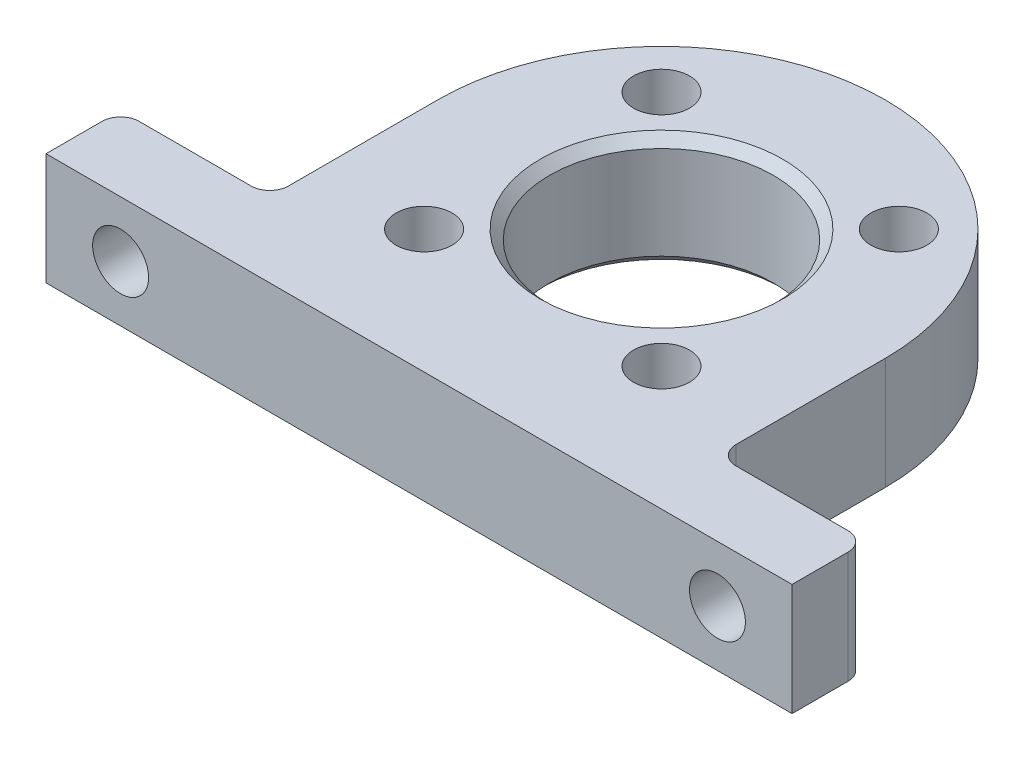
ISO-10303-21;
HEADER;
FILE_DESCRIPTION(('STEP AP214'),'2;1');
FILE_NAME('part.step','',(''),(''),'','','');
FILE_SCHEMA(('AUTOMOTIVE_DESIGN { 1 0 10303 214 1 1 1 1 }'));
ENDSEC;
DATA;
#1=APPLICATION_CONTEXT('core data for automotive mechanical design processes');
#2=APPLICATION_PROTOCOL_DEFINITION('international standard','automotive_design',2000,#1);
#3=PRODUCT_CONTEXT('',#1,'mechanical');
#4=PRODUCT('Part','Part','',(#3));
#5=PRODUCT_RELATED_PRODUCT_CATEGORY('part','',(#4));
#6=PRODUCT_DEFINITION_FORMATION('','',#4);
#7=PRODUCT_DEFINITION_CONTEXT('part definition',#1,'design');
#8=PRODUCT_DEFINITION('design','',#6,#7);
#9=PRODUCT_DEFINITION_SHAPE('','',#8);
#10=(LENGTH_UNIT() NAMED_UNIT(*) SI_UNIT(.MILLI.,.METRE.));
#11=(NAMED_UNIT(*) PLANE_ANGLE_UNIT() SI_UNIT($,.RADIAN.));
#12=(NAMED_UNIT(*) SI_UNIT($,.STERADIAN.) SOLID_ANGLE_UNIT());
#13=UNCERTAINTY_MEASURE_WITH_UNIT(LENGTH_MEASURE(1.E-05),#10,'distance_accuracy_value','');
#14=(GEOMETRIC_REPRESENTATION_CONTEXT(3) GLOBAL_UNCERTAINTY_ASSIGNED_CONTEXT((#13)) GLOBAL_UNIT_ASSIGNED_CONTEXT((#10,
#11,#12)) REPRESENTATION_CONTEXT('',''));
#15=CARTESIAN_POINT('',(0.,0.,0.));
#16=DIRECTION('',(0.,0.,1.));
#17=DIRECTION('',(1.,0.,0.));
#18=AXIS2_PLACEMENT_3D('',#15,#16,#17);
#19=CARTESIAN_POINT('',(-12.,6.,0.));
#20=DIRECTION('',(1.,0.,0.));
#21=DIRECTION('',(0.,0.,-1.));
#22=AXIS2_PLACEMENT_3D('',#19,#20,#21);
#23=PLANE('',#22);
#24=DIRECTION('',(0.,0.,1.));
#25=VECTOR('',#24,1.);
#26=CARTESIAN_POINT('',(-12.,0.,0.));
#27=LINE('',#26,#25);
#28=CARTESIAN_POINT('',(-12.,0.,0.));
#29=VERTEX_POINT('',#28);
#30=CARTESIAN_POINT('',(-12.,0.,8.));
#31=VERTEX_POINT('',#30);
#32=EDGE_CURVE('E154',#29,#31,#27,.T.);
#33=ORIENTED_EDGE('',*,*,#32,.T.);
#34=DIRECTION('',(0.,-1.,0.));
#35=VECTOR('',#34,1.);
#36=CARTESIAN_POINT('',(-12.,6.,8.));
#37=LINE('',#36,#35);
#38=CARTESIAN_POINT('',(-12.,6.,8.));
#39=VERTEX_POINT('',#38);
#40=EDGE_CURVE('E245',#31,#39,#37,.F.);
#41=ORIENTED_EDGE('',*,*,#40,.T.);
#42=DIRECTION('',(0.,0.,1.));
#43=VECTOR('',#42,1.);
#44=CARTESIAN_POINT('',(-12.,6.,0.));
#45=LINE('',#44,#43);
#46=CARTESIAN_POINT('',(-12.,6.,0.));
#47=VERTEX_POINT('',#46);
#48=EDGE_CURVE('E205',#47,#39,#45,.T.);
#49=ORIENTED_EDGE('',*,*,#48,.F.);
#50=DIRECTION('',(0.,-1.,0.));
#51=VECTOR('',#50,1.);
#52=CARTESIAN_POINT('',(-12.,6.,0.));
#53=LINE('',#52,#51);
#54=EDGE_CURVE('E218',#47,#29,#53,.T.);
#55=ORIENTED_EDGE('',*,*,#54,.T.);
#56=EDGE_LOOP('',(#33,#41,#49,#55));
#57=FACE_BOUND('',#56,.T.);
#58=ADVANCED_FACE('F41',(#57),#23,.F.);
#59=CARTESIAN_POINT('',(12.,6.,0.));
#60=DIRECTION('',(-1.,0.,0.));
#61=DIRECTION('',(0.,0.,1.));
#62=AXIS2_PLACEMENT_3D('',#59,#60,#61);
#63=PLANE('',#62);
#64=DIRECTION('',(0.,0.,-1.));
#65=VECTOR('',#64,1.);
#66=CARTESIAN_POINT('',(12.,6.,0.));
#67=LINE('',#66,#65);
#68=CARTESIAN_POINT('',(12.,6.,8.));
#69=VERTEX_POINT('',#68);
#70=CARTESIAN_POINT('',(12.,6.,0.));
#71=VERTEX_POINT('',#70);
#72=EDGE_CURVE('E209',#69,#71,#67,.T.);
#73=ORIENTED_EDGE('',*,*,#72,.F.);
#74=DIRECTION('',(0.,1.,0.));
#75=VECTOR('',#74,1.);
#76=CARTESIAN_POINT('',(12.,0.,8.));
#77=LINE('',#76,#75);
#78=CARTESIAN_POINT('',(12.,0.,8.));
#79=VERTEX_POINT('',#78);
#80=EDGE_CURVE('E57',#69,#79,#77,.F.);
#81=ORIENTED_EDGE('',*,*,#80,.T.);
#82=DIRECTION('',(0.,0.,-1.));
#83=VECTOR('',#82,1.);
#84=CARTESIAN_POINT('',(12.,0.,0.));
#85=LINE('',#84,#83);
#86=CARTESIAN_POINT('',(12.,0.,0.));
#87=VERTEX_POINT('',#86);
#88=EDGE_CURVE('E153',#79,#87,#85,.T.);
#89=ORIENTED_EDGE('',*,*,#88,.T.);
#90=DIRECTION('',(0.,-1.,0.));
#91=VECTOR('',#90,1.);
#92=CARTESIAN_POINT('',(12.,6.,0.));
#93=LINE('',#92,#91);
#94=EDGE_CURVE('E211',#71,#87,#93,.T.);
#95=ORIENTED_EDGE('',*,*,#94,.F.);
#96=EDGE_LOOP('',(#73,#81,#89,#95));
#97=FACE_BOUND('',#96,.T.);
#98=ADVANCED_FACE('F292',(#97),#63,.F.);
#99=CARTESIAN_POINT('',(0.,6.,0.));
#100=DIRECTION('',(0.,-1.,0.));
#101=DIRECTION('',(0.,0.,-1.));
#102=AXIS2_PLACEMENT_3D('',#99,#100,#101);
#103=CYLINDRICAL_SURFACE('',#102,12.);
#104=CARTESIAN_POINT('',(0.,0.,0.));
#105=DIRECTION('',(0.,1.,0.));
#106=DIRECTION('',(0.,0.,1.));
#107=AXIS2_PLACEMENT_3D('',#104,#105,#106);
#108=CIRCLE('',#107,12.);
#109=EDGE_CURVE('E199',#87,#29,#108,.T.);
#110=ORIENTED_EDGE('',*,*,#109,.T.);
#111=ORIENTED_EDGE('',*,*,#54,.F.);
#112=CARTESIAN_POINT('',(0.,6.,0.));
#113=DIRECTION('',(0.,1.,0.));
#114=DIRECTION('',(0.,0.,1.));
#115=AXIS2_PLACEMENT_3D('',#112,#113,#114);
#116=CIRCLE('',#115,12.);
#117=EDGE_CURVE('E202',#71,#47,#116,.T.);
#118=ORIENTED_EDGE('',*,*,#117,.F.);
#119=ORIENTED_EDGE('',*,*,#94,.T.);
#120=EDGE_LOOP('',(#110,#111,#118,#119));
#121=FACE_BOUND('',#120,.T.);
#122=ADVANCED_FACE('F298',(#121),#103,.T.);
#123=CARTESIAN_POINT('',(-12.,6.,13.));
#124=DIRECTION('',(0.,0.,-1.));
#125=DIRECTION('',(-1.,0.,0.));
#126=AXIS2_PLACEMENT_3D('',#123,#124,#125);
#127=PLANE('',#126);
#128=CARTESIAN_POINT('',(-16.,3.,13.));
#129=DIRECTION('',(0.,0.,1.));
#130=DIRECTION('',(1.,0.,0.));
#131=AXIS2_PLACEMENT_3D('',#128,#129,#130);
#132=CIRCLE('',#131,1.5);
#133=CARTESIAN_POINT('',(-14.5,3.,13.));
#134=VERTEX_POINT('',#133);
#135=EDGE_CURVE('E223',#134,#134,#132,.T.);
#136=ORIENTED_EDGE('',*,*,#135,.F.);
#137=EDGE_LOOP('',(#136));
#138=FACE_BOUND('',#137,.T.);
#139=CARTESIAN_POINT('',(16.,3.,13.));
#140=DIRECTION('',(0.,0.,1.));
#141=DIRECTION('',(1.,0.,0.));
#142=AXIS2_PLACEMENT_3D('',#139,#140,#141);
#143=CIRCLE('',#142,1.5);
#144=CARTESIAN_POINT('',(17.5,3.,13.));
#145=VERTEX_POINT('',#144);
#146=EDGE_CURVE('E338',#145,#145,#143,.T.);
#147=ORIENTED_EDGE('',*,*,#146,.F.);
#148=EDGE_LOOP('',(#147));
#149=FACE_BOUND('',#148,.T.);
#150=DIRECTION('',(1.,0.,0.));
#151=VECTOR('',#150,1.);
#152=CARTESIAN_POINT('',(-12.,0.,13.));
#153=LINE('',#152,#151);
#154=CARTESIAN_POINT('',(-20.,0.,13.));
#155=VERTEX_POINT('',#154);
#156=CARTESIAN_POINT('',(20.,0.,13.));
#157=VERTEX_POINT('',#156);
#158=EDGE_CURVE('E145',#155,#157,#153,.T.);
#159=ORIENTED_EDGE('',*,*,#158,.T.);
#160=DIRECTION('',(0.,1.,0.));
#161=VECTOR('',#160,1.);
#162=CARTESIAN_POINT('',(20.,6.,13.));
#163=LINE('',#162,#161);
#164=CARTESIAN_POINT('',(20.,6.,13.));
#165=VERTEX_POINT('',#164);
#166=EDGE_CURVE('E160',#157,#165,#163,.T.);
#167=ORIENTED_EDGE('',*,*,#166,.T.);
#168=DIRECTION('',(1.,0.,0.));
#169=VECTOR('',#168,1.);
#170=CARTESIAN_POINT('',(-12.,6.,13.));
#171=LINE('',#170,#169);
#172=CARTESIAN_POINT('',(-20.,6.,13.));
#173=VERTEX_POINT('',#172);
#174=EDGE_CURVE('E159',#173,#165,#171,.T.);
#175=ORIENTED_EDGE('',*,*,#174,.F.);
#176=DIRECTION('',(0.,-1.,0.));
#177=VECTOR('',#176,1.);
#178=CARTESIAN_POINT('',(-20.,6.,13.));
#179=LINE('',#178,#177);
#180=EDGE_CURVE('E138',#173,#155,#179,.T.);
#181=ORIENTED_EDGE('',*,*,#180,.T.);
#182=EDGE_LOOP('',(#159,#167,#175,#181));
#183=FACE_BOUND('',#182,.T.);
#184=ADVANCED_FACE('F157',(#138,#149,#183),#127,.F.);
#185=CARTESIAN_POINT('',(0.,6.,0.));
#186=DIRECTION('',(0.,1.,0.));
#187=DIRECTION('',(0.,0.,1.));
#188=AXIS2_PLACEMENT_3D('',#185,#186,#187);
#189=PLANE('',#188);
#190=CARTESIAN_POINT('',(0.,6.,0.));
#191=DIRECTION('',(0.,1.,0.));
#192=DIRECTION('',(0.,0.,1.));
#193=AXIS2_PLACEMENT_3D('',#190,#191,#192);
#194=CIRCLE('',#193,6.49999999999999);
#195=CARTESIAN_POINT('',(0.,6.,6.49999999999999));
#196=VERTEX_POINT('',#195);
#197=EDGE_CURVE('E50',#196,#196,#194,.F.);
#198=ORIENTED_EDGE('',*,*,#197,.T.);
#199=EDGE_LOOP('',(#198));
#200=FACE_BOUND('',#199,.T.);
#201=DIRECTION('',(0.,0.,1.));
#202=VECTOR('',#201,1.);
#203=CARTESIAN_POINT('',(20.,6.,9.));
#204=LINE('',#203,#202);
#205=CARTESIAN_POINT('',(20.,6.,10.));
#206=VERTEX_POINT('',#205);
#207=EDGE_CURVE('E175',#206,#165,#204,.T.);
#208=ORIENTED_EDGE('',*,*,#207,.F.);
#209=CARTESIAN_POINT('',(19.,6.,10.));
#210=DIRECTION('',(0.,1.,0.));
#211=DIRECTION('',(0.,0.,1.));
#212=AXIS2_PLACEMENT_3D('',#209,#210,#211);
#213=CIRCLE('',#212,1.);
#214=CARTESIAN_POINT('',(19.,6.,9.));
#215=VERTEX_POINT('',#214);
#216=EDGE_CURVE('E229',#206,#215,#213,.T.);
#217=ORIENTED_EDGE('',*,*,#216,.T.);
#218=DIRECTION('',(-1.,0.,0.));
#219=VECTOR('',#218,1.);
#220=CARTESIAN_POINT('',(-20.,6.,9.));
#221=LINE('',#220,#219);
#222=CARTESIAN_POINT('',(13.,6.,9.));
#223=VERTEX_POINT('',#222);
#224=EDGE_CURVE('E142',#215,#223,#221,.T.);
#225=ORIENTED_EDGE('',*,*,#224,.T.);
#226=CARTESIAN_POINT('',(13.,6.,8.));
#227=DIRECTION('',(0.,1.,0.));
#228=DIRECTION('',(0.,0.,1.));
#229=AXIS2_PLACEMENT_3D('',#226,#227,#228);
#230=CIRCLE('',#229,1.);
#231=EDGE_CURVE('E252',#223,#69,#230,.F.);
#232=ORIENTED_EDGE('',*,*,#231,.T.);
#233=ORIENTED_EDGE('',*,*,#72,.T.);
#234=ORIENTED_EDGE('',*,*,#117,.T.);
#235=ORIENTED_EDGE('',*,*,#48,.T.);
#236=CARTESIAN_POINT('',(-13.,6.,8.));
#237=DIRECTION('',(0.,1.,0.));
#238=DIRECTION('',(0.,0.,1.));
#239=AXIS2_PLACEMENT_3D('',#236,#237,#238);
#240=CIRCLE('',#239,1.);
#241=CARTESIAN_POINT('',(-13.,6.,9.));
#242=VERTEX_POINT('',#241);
#243=EDGE_CURVE('E250',#39,#242,#240,.F.);
#244=ORIENTED_EDGE('',*,*,#243,.T.);
#245=CARTESIAN_POINT('',(-19.,6.,9.));
#246=VERTEX_POINT('',#245);
#247=EDGE_CURVE('E169',#242,#246,#221,.T.);
#248=ORIENTED_EDGE('',*,*,#247,.T.);
#249=CARTESIAN_POINT('',(-19.,6.,10.));
#250=DIRECTION('',(0.,1.,0.));
#251=DIRECTION('',(0.,0.,1.));
#252=AXIS2_PLACEMENT_3D('',#249,#250,#251);
#253=CIRCLE('',#252,1.);
#254=CARTESIAN_POINT('',(-20.,6.,10.));
#255=VERTEX_POINT('',#254);
#256=EDGE_CURVE('E227',#246,#255,#253,.T.);
#257=ORIENTED_EDGE('',*,*,#256,.T.);
#258=DIRECTION('',(0.,0.,1.));
#259=VECTOR('',#258,1.);
#260=CARTESIAN_POINT('',(-20.,6.,9.));
#261=LINE('',#260,#259);
#262=EDGE_CURVE('E172',#255,#173,#261,.T.);
#263=ORIENTED_EDGE('',*,*,#262,.T.);
#264=ORIENTED_EDGE('',*,*,#174,.T.);
#265=EDGE_LOOP('',(#208,#217,#225,#232,#233,#234,#235,#244,#248,#257,#263,#264));
#266=FACE_BOUND('',#265,.T.);
#267=CARTESIAN_POINT('',(-6.36396103067859,6.,6.36396103067894));
#268=DIRECTION('',(0.,1.,0.));
#269=DIRECTION('',(0.,0.,1.));
#270=AXIS2_PLACEMENT_3D('',#267,#268,#269);
#271=CIRCLE('',#270,1.5);
#272=CARTESIAN_POINT('',(-6.36396103067859,6.,7.86396103067894));
#273=VERTEX_POINT('',#272);
#274=EDGE_CURVE('E191',#273,#273,#271,.T.);
#275=ORIENTED_EDGE('',*,*,#274,.F.);
#276=EDGE_LOOP('',(#275));
#277=FACE_BOUND('',#276,.T.);
#278=CARTESIAN_POINT('',(6.36396103067926,6.,6.3639610306786));
#279=DIRECTION('',(0.,1.,0.));
#280=DIRECTION('',(0.,0.,1.));
#281=AXIS2_PLACEMENT_3D('',#278,#279,#280);
#282=CIRCLE('',#281,1.5);
#283=CARTESIAN_POINT('',(6.36396103067926,6.,7.8639610306786));
#284=VERTEX_POINT('',#283);
#285=EDGE_CURVE('E185',#284,#284,#282,.T.);
#286=ORIENTED_EDGE('',*,*,#285,.F.);
#287=EDGE_LOOP('',(#286));
#288=FACE_BOUND('',#287,.T.);
#289=CARTESIAN_POINT('',(6.36396103067891,6.,-6.36396103067926));
#290=DIRECTION('',(0.,1.,0.));
#291=DIRECTION('',(0.,0.,1.));
#292=AXIS2_PLACEMENT_3D('',#289,#290,#291);
#293=CIRCLE('',#292,1.5);
#294=CARTESIAN_POINT('',(6.36396103067891,6.,-4.86396103067926));
#295=VERTEX_POINT('',#294);
#296=EDGE_CURVE('E178',#295,#295,#293,.T.);
#297=ORIENTED_EDGE('',*,*,#296,.F.);
#298=EDGE_LOOP('',(#297));
#299=FACE_BOUND('',#298,.T.);
#300=CARTESIAN_POINT('',(-6.36396103067894,6.,-6.36396103067891));
#301=DIRECTION('',(0.,1.,0.));
#302=DIRECTION('',(0.,0.,1.));
#303=AXIS2_PLACEMENT_3D('',#300,#301,#302);
#304=CIRCLE('',#303,1.5);
#305=CARTESIAN_POINT('',(-6.36396103067894,6.,-4.86396103067891));
#306=VERTEX_POINT('',#305);
#307=EDGE_CURVE('E181',#306,#306,#304,.T.);
#308=ORIENTED_EDGE('',*,*,#307,.F.);
#309=EDGE_LOOP('',(#308));
#310=FACE_BOUND('',#309,.T.);
#311=ADVANCED_FACE('F264',(#200,#266,#277,#288,#299,#310),#189,.T.);
#312=CARTESIAN_POINT('',(0.,0.,0.));
#313=DIRECTION('',(0.,1.,0.));
#314=DIRECTION('',(0.,0.,1.));
#315=AXIS2_PLACEMENT_3D('',#312,#313,#314);
#316=PLANE('',#315);
#317=CARTESIAN_POINT('',(0.,0.,0.));
#318=DIRECTION('',(0.,1.,0.));
#319=DIRECTION('',(0.,0.,1.));
#320=AXIS2_PLACEMENT_3D('',#317,#318,#319);
#321=CIRCLE('',#320,6.49999999999999);
#322=CARTESIAN_POINT('',(0.,0.,6.49999999999999));
#323=VERTEX_POINT('',#322);
#324=EDGE_CURVE('E11',#323,#323,#321,.T.);
#325=ORIENTED_EDGE('',*,*,#324,.T.);
#326=EDGE_LOOP('',(#325));
#327=FACE_BOUND('',#326,.T.);
#328=DIRECTION('',(1.,0.,0.));
#329=VECTOR('',#328,1.);
#330=CARTESIAN_POINT('',(-20.,0.,9.));
#331=LINE('',#330,#329);
#332=CARTESIAN_POINT('',(13.,0.,9.));
#333=VERTEX_POINT('',#332);
#334=CARTESIAN_POINT('',(19.,0.,9.));
#335=VERTEX_POINT('',#334);
#336=EDGE_CURVE('E163',#333,#335,#331,.T.);
#337=ORIENTED_EDGE('',*,*,#336,.T.);
#338=CARTESIAN_POINT('',(19.,0.,10.));
#339=DIRECTION('',(0.,1.,0.));
#340=DIRECTION('',(0.,0.,1.));
#341=AXIS2_PLACEMENT_3D('',#338,#339,#340);
#342=CIRCLE('',#341,1.);
#343=CARTESIAN_POINT('',(20.,0.,10.));
#344=VERTEX_POINT('',#343);
#345=EDGE_CURVE('E238',#335,#344,#342,.F.);
#346=ORIENTED_EDGE('',*,*,#345,.T.);
#347=DIRECTION('',(0.,0.,1.));
#348=VECTOR('',#347,1.);
#349=CARTESIAN_POINT('',(20.,0.,9.));
#350=LINE('',#349,#348);
#351=EDGE_CURVE('E141',#344,#157,#350,.T.);
#352=ORIENTED_EDGE('',*,*,#351,.T.);
#353=ORIENTED_EDGE('',*,*,#158,.F.);
#354=DIRECTION('',(0.,0.,1.));
#355=VECTOR('',#354,1.);
#356=CARTESIAN_POINT('',(-20.,0.,9.));
#357=LINE('',#356,#355);
#358=CARTESIAN_POINT('',(-20.,0.,10.));
#359=VERTEX_POINT('',#358);
#360=EDGE_CURVE('E133',#359,#155,#357,.T.);
#361=ORIENTED_EDGE('',*,*,#360,.F.);
#362=CARTESIAN_POINT('',(-19.,0.,10.));
#363=DIRECTION('',(0.,1.,0.));
#364=DIRECTION('',(0.,0.,1.));
#365=AXIS2_PLACEMENT_3D('',#362,#363,#364);
#366=CIRCLE('',#365,1.);
#367=CARTESIAN_POINT('',(-19.,0.,9.));
#368=VERTEX_POINT('',#367);
#369=EDGE_CURVE('E236',#359,#368,#366,.F.);
#370=ORIENTED_EDGE('',*,*,#369,.T.);
#371=CARTESIAN_POINT('',(-13.,0.,9.));
#372=VERTEX_POINT('',#371);
#373=EDGE_CURVE('E336',#368,#372,#331,.T.);
#374=ORIENTED_EDGE('',*,*,#373,.T.);
#375=CARTESIAN_POINT('',(-13.,0.,8.));
#376=DIRECTION('',(0.,1.,0.));
#377=DIRECTION('',(0.,0.,1.));
#378=AXIS2_PLACEMENT_3D('',#375,#376,#377);
#379=CIRCLE('',#378,1.);
#380=EDGE_CURVE('E65',#372,#31,#379,.T.);
#381=ORIENTED_EDGE('',*,*,#380,.T.);
#382=ORIENTED_EDGE('',*,*,#32,.F.);
#383=ORIENTED_EDGE('',*,*,#109,.F.);
#384=ORIENTED_EDGE('',*,*,#88,.F.);
#385=CARTESIAN_POINT('',(13.,0.,8.));
#386=DIRECTION('',(0.,1.,0.));
#387=DIRECTION('',(0.,0.,1.));
#388=AXIS2_PLACEMENT_3D('',#385,#386,#387);
#389=CIRCLE('',#388,1.);
#390=EDGE_CURVE('E254',#79,#333,#389,.T.);
#391=ORIENTED_EDGE('',*,*,#390,.T.);
#392=EDGE_LOOP('',(#337,#346,#352,#353,#361,#370,#374,#381,#382,#383,#384,#391));
#393=FACE_BOUND('',#392,.T.);
#394=CARTESIAN_POINT('',(-6.36396103067894,0.,-6.36396103067891));
#395=DIRECTION('',(0.,1.,0.));
#396=DIRECTION('',(0.,0.,1.));
#397=AXIS2_PLACEMENT_3D('',#394,#395,#396);
#398=CIRCLE('',#397,1.5);
#399=CARTESIAN_POINT('',(-6.36396103067894,0.,-4.86396103067891));
#400=VERTEX_POINT('',#399);
#401=EDGE_CURVE('E196',#400,#400,#398,.T.);
#402=ORIENTED_EDGE('',*,*,#401,.T.);
#403=EDGE_LOOP('',(#402));
#404=FACE_BOUND('',#403,.T.);
#405=CARTESIAN_POINT('',(6.36396103067891,0.,-6.36396103067926));
#406=DIRECTION('',(0.,1.,0.));
#407=DIRECTION('',(0.,0.,1.));
#408=AXIS2_PLACEMENT_3D('',#405,#406,#407);
#409=CIRCLE('',#408,1.5);
#410=CARTESIAN_POINT('',(6.36396103067891,0.,-4.86396103067926));
#411=VERTEX_POINT('',#410);
#412=EDGE_CURVE('E182',#411,#411,#409,.T.);
#413=ORIENTED_EDGE('',*,*,#412,.T.);
#414=EDGE_LOOP('',(#413));
#415=FACE_BOUND('',#414,.T.);
#416=CARTESIAN_POINT('',(6.36396103067926,0.,6.3639610306786));
#417=DIRECTION('',(0.,1.,0.));
#418=DIRECTION('',(0.,0.,1.));
#419=AXIS2_PLACEMENT_3D('',#416,#417,#418);
#420=CIRCLE('',#419,1.5);
#421=CARTESIAN_POINT('',(6.36396103067926,0.,7.8639610306786));
#422=VERTEX_POINT('',#421);
#423=EDGE_CURVE('E188',#422,#422,#420,.T.);
#424=ORIENTED_EDGE('',*,*,#423,.T.);
#425=EDGE_LOOP('',(#424));
#426=FACE_BOUND('',#425,.T.);
#427=CARTESIAN_POINT('',(-6.36396103067859,0.,6.36396103067894));
#428=DIRECTION('',(0.,1.,0.));
#429=DIRECTION('',(0.,0.,1.));
#430=AXIS2_PLACEMENT_3D('',#427,#428,#429);
#431=CIRCLE('',#430,1.5);
#432=CARTESIAN_POINT('',(-6.36396103067859,0.,7.86396103067894));
#433=VERTEX_POINT('',#432);
#434=EDGE_CURVE('E174',#433,#433,#431,.T.);
#435=ORIENTED_EDGE('',*,*,#434,.T.);
#436=EDGE_LOOP('',(#435));
#437=FACE_BOUND('',#436,.T.);
#438=ADVANCED_FACE('F147',(#327,#393,#404,#415,#426,#437),#316,.F.);
#439=CARTESIAN_POINT('',(0.,0.,0.));
#440=DIRECTION('',(0.,1.,0.));
#441=DIRECTION('',(0.,0.,1.));
#442=AXIS2_PLACEMENT_3D('',#439,#440,#441);
#443=CYLINDRICAL_SURFACE('',#442,6.);
#444=CARTESIAN_POINT('',(0.,5.5,0.));
#445=DIRECTION('',(0.,1.,0.));
#446=DIRECTION('',(0.,0.,1.));
#447=AXIS2_PLACEMENT_3D('',#444,#445,#446);
#448=CIRCLE('',#447,6.);
#449=CARTESIAN_POINT('',(0.,5.5,6.));
#450=VERTEX_POINT('',#449);
#451=EDGE_CURVE('E259',#450,#450,#448,.T.);
#452=ORIENTED_EDGE('',*,*,#451,.T.);
#453=EDGE_LOOP('',(#452));
#454=FACE_BOUND('',#453,.T.);
#455=CARTESIAN_POINT('',(0.,0.499999999999994,0.));
#456=DIRECTION('',(0.,1.,0.));
#457=DIRECTION('',(0.,0.,1.));
#458=AXIS2_PLACEMENT_3D('',#455,#456,#457);
#459=CIRCLE('',#458,6.);
#460=CARTESIAN_POINT('',(0.,0.499999999999994,6.));
#461=VERTEX_POINT('',#460);
#462=EDGE_CURVE('E256',#461,#461,#459,.F.);
#463=ORIENTED_EDGE('',*,*,#462,.T.);
#464=EDGE_LOOP('',(#463));
#465=FACE_BOUND('',#464,.T.);
#466=ADVANCED_FACE('F273',(#454,#465),#443,.F.);
#467=CARTESIAN_POINT('',(-6.36396103067894,0.,-6.36396103067891));
#468=DIRECTION('',(0.,1.,0.));
#469=DIRECTION('',(0.,0.,1.));
#470=AXIS2_PLACEMENT_3D('',#467,#468,#469);
#471=CYLINDRICAL_SURFACE('',#470,1.5);
#472=ORIENTED_EDGE('',*,*,#401,.F.);
#473=EDGE_LOOP('',(#472));
#474=FACE_BOUND('',#473,.T.);
#475=ORIENTED_EDGE('',*,*,#307,.T.);
#476=EDGE_LOOP('',(#475));
#477=FACE_BOUND('',#476,.T.);
#478=ADVANCED_FACE('F276',(#474,#477),#471,.F.);
#479=CARTESIAN_POINT('',(6.36396103067891,0.,-6.36396103067926));
#480=DIRECTION('',(0.,1.,0.));
#481=DIRECTION('',(0.,0.,1.));
#482=AXIS2_PLACEMENT_3D('',#479,#480,#481);
#483=CYLINDRICAL_SURFACE('',#482,1.5);
#484=ORIENTED_EDGE('',*,*,#412,.F.);
#485=EDGE_LOOP('',(#484));
#486=FACE_BOUND('',#485,.T.);
#487=ORIENTED_EDGE('',*,*,#296,.T.);
#488=EDGE_LOOP('',(#487));
#489=FACE_BOUND('',#488,.T.);
#490=ADVANCED_FACE('F372',(#486,#489),#483,.F.);
#491=CARTESIAN_POINT('',(6.36396103067926,0.,6.3639610306786));
#492=DIRECTION('',(0.,1.,0.));
#493=DIRECTION('',(0.,0.,1.));
#494=AXIS2_PLACEMENT_3D('',#491,#492,#493);
#495=CYLINDRICAL_SURFACE('',#494,1.5);
#496=ORIENTED_EDGE('',*,*,#423,.F.);
#497=EDGE_LOOP('',(#496));
#498=FACE_BOUND('',#497,.T.);
#499=ORIENTED_EDGE('',*,*,#285,.T.);
#500=EDGE_LOOP('',(#499));
#501=FACE_BOUND('',#500,.T.);
#502=ADVANCED_FACE('F375',(#498,#501),#495,.F.);
#503=CARTESIAN_POINT('',(-6.36396103067859,0.,6.36396103067894));
#504=DIRECTION('',(0.,1.,0.));
#505=DIRECTION('',(0.,0.,1.));
#506=AXIS2_PLACEMENT_3D('',#503,#504,#505);
#507=CYLINDRICAL_SURFACE('',#506,1.5);
#508=ORIENTED_EDGE('',*,*,#434,.F.);
#509=EDGE_LOOP('',(#508));
#510=FACE_BOUND('',#509,.T.);
#511=ORIENTED_EDGE('',*,*,#274,.T.);
#512=EDGE_LOOP('',(#511));
#513=FACE_BOUND('',#512,.T.);
#514=ADVANCED_FACE('F365',(#510,#513),#507,.F.);
#515=CARTESIAN_POINT('',(20.,6.,9.));
#516=DIRECTION('',(1.,0.,0.));
#517=DIRECTION('',(0.,1.,0.));
#518=AXIS2_PLACEMENT_3D('',#515,#516,#517);
#519=PLANE('',#518);
#520=ORIENTED_EDGE('',*,*,#351,.F.);
#521=DIRECTION('',(0.,1.,0.));
#522=VECTOR('',#521,1.);
#523=CARTESIAN_POINT('',(20.,6.,10.));
#524=LINE('',#523,#522);
#525=EDGE_CURVE('E221',#344,#206,#524,.T.);
#526=ORIENTED_EDGE('',*,*,#525,.T.);
#527=ORIENTED_EDGE('',*,*,#207,.T.);
#528=ORIENTED_EDGE('',*,*,#166,.F.);
#529=EDGE_LOOP('',(#520,#526,#527,#528));
#530=FACE_BOUND('',#529,.T.);
#531=ADVANCED_FACE('F358',(#530),#519,.T.);
#532=CARTESIAN_POINT('',(0.,0.,9.));
#533=DIRECTION('',(0.,0.,1.));
#534=DIRECTION('',(1.,0.,0.));
#535=AXIS2_PLACEMENT_3D('',#532,#533,#534);
#536=PLANE('',#535);
#537=CARTESIAN_POINT('',(16.,3.,9.));
#538=DIRECTION('',(0.,0.,1.));
#539=DIRECTION('',(1.,0.,0.));
#540=AXIS2_PLACEMENT_3D('',#537,#538,#539);
#541=CIRCLE('',#540,1.5);
#542=CARTESIAN_POINT('',(17.5,3.,9.));
#543=VERTEX_POINT('',#542);
#544=EDGE_CURVE('E161',#543,#543,#541,.T.);
#545=ORIENTED_EDGE('',*,*,#544,.T.);
#546=EDGE_LOOP('',(#545));
#547=FACE_BOUND('',#546,.T.);
#548=ORIENTED_EDGE('',*,*,#224,.F.);
#549=DIRECTION('',(0.,1.,0.));
#550=VECTOR('',#549,1.);
#551=CARTESIAN_POINT('',(19.,0.,9.));
#552=LINE('',#551,#550);
#553=EDGE_CURVE('E234',#215,#335,#552,.F.);
#554=ORIENTED_EDGE('',*,*,#553,.T.);
#555=ORIENTED_EDGE('',*,*,#336,.F.);
#556=DIRECTION('',(0.,1.,0.));
#557=VECTOR('',#556,1.);
#558=CARTESIAN_POINT('',(13.,6.,9.));
#559=LINE('',#558,#557);
#560=EDGE_CURVE('E231',#333,#223,#559,.T.);
#561=ORIENTED_EDGE('',*,*,#560,.T.);
#562=EDGE_LOOP('',(#548,#554,#555,#561));
#563=FACE_BOUND('',#562,.T.);
#564=ADVANCED_FACE('F333',(#547,#563),#536,.F.);
#565=CARTESIAN_POINT('',(-16.,3.,9.));
#566=DIRECTION('',(0.,0.,1.));
#567=DIRECTION('',(1.,0.,0.));
#568=AXIS2_PLACEMENT_3D('',#565,#566,#567);
#569=CIRCLE('',#568,1.5);
#570=CARTESIAN_POINT('',(-14.5,3.,9.));
#571=VERTEX_POINT('',#570);
#572=EDGE_CURVE('E166',#571,#571,#569,.T.);
#573=ORIENTED_EDGE('',*,*,#572,.T.);
#574=EDGE_LOOP('',(#573));
#575=FACE_BOUND('',#574,.T.);
#576=ORIENTED_EDGE('',*,*,#247,.F.);
#577=DIRECTION('',(0.,-1.,0.));
#578=VECTOR('',#577,1.);
#579=CARTESIAN_POINT('',(-13.,0.,9.));
#580=LINE('',#579,#578);
#581=EDGE_CURVE('E242',#242,#372,#580,.T.);
#582=ORIENTED_EDGE('',*,*,#581,.T.);
#583=ORIENTED_EDGE('',*,*,#373,.F.);
#584=DIRECTION('',(0.,-1.,0.));
#585=VECTOR('',#584,1.);
#586=CARTESIAN_POINT('',(-19.,6.,9.));
#587=LINE('',#586,#585);
#588=EDGE_CURVE('E240',#368,#246,#587,.F.);
#589=ORIENTED_EDGE('',*,*,#588,.T.);
#590=EDGE_LOOP('',(#576,#582,#583,#589));
#591=FACE_BOUND('',#590,.T.);
#592=ADVANCED_FACE('F357',(#575,#591),#536,.F.);
#593=CARTESIAN_POINT('',(-20.,6.,9.));
#594=DIRECTION('',(-1.,0.,0.));
#595=DIRECTION('',(0.,-1.,0.));
#596=AXIS2_PLACEMENT_3D('',#593,#594,#595);
#597=PLANE('',#596);
#598=ORIENTED_EDGE('',*,*,#262,.F.);
#599=DIRECTION('',(0.,-1.,0.));
#600=VECTOR('',#599,1.);
#601=CARTESIAN_POINT('',(-20.,0.,10.));
#602=LINE('',#601,#600);
#603=EDGE_CURVE('E140',#255,#359,#602,.T.);
#604=ORIENTED_EDGE('',*,*,#603,.T.);
#605=ORIENTED_EDGE('',*,*,#360,.T.);
#606=ORIENTED_EDGE('',*,*,#180,.F.);
#607=EDGE_LOOP('',(#598,#604,#605,#606));
#608=FACE_BOUND('',#607,.T.);
#609=ADVANCED_FACE('F136',(#608),#597,.T.);
#610=CARTESIAN_POINT('',(-16.,3.,8.));
#611=DIRECTION('',(0.,0.,1.));
#612=DIRECTION('',(1.,0.,0.));
#613=AXIS2_PLACEMENT_3D('',#610,#611,#612);
#614=CYLINDRICAL_SURFACE('',#613,1.5);
#615=ORIENTED_EDGE('',*,*,#135,.T.);
#616=EDGE_LOOP('',(#615));
#617=FACE_BOUND('',#616,.T.);
#618=ORIENTED_EDGE('',*,*,#572,.F.);
#619=EDGE_LOOP('',(#618));
#620=FACE_BOUND('',#619,.T.);
#621=ADVANCED_FACE('F344',(#617,#620),#614,.F.);
#622=CARTESIAN_POINT('',(16.,3.,8.));
#623=DIRECTION('',(0.,0.,1.));
#624=DIRECTION('',(1.,0.,0.));
#625=AXIS2_PLACEMENT_3D('',#622,#623,#624);
#626=CYLINDRICAL_SURFACE('',#625,1.5);
#627=ORIENTED_EDGE('',*,*,#146,.T.);
#628=EDGE_LOOP('',(#627));
#629=FACE_BOUND('',#628,.T.);
#630=ORIENTED_EDGE('',*,*,#544,.F.);
#631=EDGE_LOOP('',(#630));
#632=FACE_BOUND('',#631,.T.);
#633=ADVANCED_FACE('F308',(#629,#632),#626,.F.);
#634=CARTESIAN_POINT('',(19.,6.,10.));
#635=DIRECTION('',(0.,-1.,0.));
#636=DIRECTION('',(1.,0.,0.));
#637=AXIS2_PLACEMENT_3D('',#634,#635,#636);
#638=CYLINDRICAL_SURFACE('',#637,1.);
#639=ORIENTED_EDGE('',*,*,#345,.F.);
#640=ORIENTED_EDGE('',*,*,#553,.F.);
#641=ORIENTED_EDGE('',*,*,#216,.F.);
#642=ORIENTED_EDGE('',*,*,#525,.F.);
#643=EDGE_LOOP('',(#639,#640,#641,#642));
#644=FACE_BOUND('',#643,.T.);
#645=ADVANCED_FACE('F304',(#644),#638,.T.);
#646=CARTESIAN_POINT('',(-13.,0.,8.));
#647=DIRECTION('',(0.,1.,0.));
#648=DIRECTION('',(0.,0.,1.));
#649=AXIS2_PLACEMENT_3D('',#646,#647,#648);
#650=CYLINDRICAL_SURFACE('',#649,1.);
#651=ORIENTED_EDGE('',*,*,#243,.F.);
#652=ORIENTED_EDGE('',*,*,#40,.F.);
#653=ORIENTED_EDGE('',*,*,#380,.F.);
#654=ORIENTED_EDGE('',*,*,#581,.F.);
#655=EDGE_LOOP('',(#651,#652,#653,#654));
#656=FACE_BOUND('',#655,.T.);
#657=ADVANCED_FACE('F307',(#656),#650,.F.);
#658=CARTESIAN_POINT('',(-19.,6.,10.));
#659=DIRECTION('',(0.,1.,0.));
#660=DIRECTION('',(-1.,0.,0.));
#661=AXIS2_PLACEMENT_3D('',#658,#659,#660);
#662=CYLINDRICAL_SURFACE('',#661,1.);
#663=ORIENTED_EDGE('',*,*,#256,.F.);
#664=ORIENTED_EDGE('',*,*,#588,.F.);
#665=ORIENTED_EDGE('',*,*,#369,.F.);
#666=ORIENTED_EDGE('',*,*,#603,.F.);
#667=EDGE_LOOP('',(#663,#664,#665,#666));
#668=FACE_BOUND('',#667,.T.);
#669=ADVANCED_FACE('F312',(#668),#662,.T.);
#670=CARTESIAN_POINT('',(13.,0.,8.));
#671=DIRECTION('',(0.,-1.,0.));
#672=DIRECTION('',(0.,0.,-1.));
#673=AXIS2_PLACEMENT_3D('',#670,#671,#672);
#674=CYLINDRICAL_SURFACE('',#673,1.);
#675=ORIENTED_EDGE('',*,*,#390,.F.);
#676=ORIENTED_EDGE('',*,*,#80,.F.);
#677=ORIENTED_EDGE('',*,*,#231,.F.);
#678=ORIENTED_EDGE('',*,*,#560,.F.);
#679=EDGE_LOOP('',(#675,#676,#677,#678));
#680=FACE_BOUND('',#679,.T.);
#681=ADVANCED_FACE('F270',(#680),#674,.F.);
#682=CARTESIAN_POINT('',(0.,5.5,0.));
#683=DIRECTION('',(0.,1.,0.));
#684=DIRECTION('',(0.,0.,1.));
#685=AXIS2_PLACEMENT_3D('',#682,#683,#684);
#686=CONICAL_SURFACE('',#685,6.,0.785398163397441);
#687=ORIENTED_EDGE('',*,*,#197,.F.);
#688=EDGE_LOOP('',(#687));
#689=FACE_BOUND('',#688,.T.);
#690=ORIENTED_EDGE('',*,*,#451,.F.);
#691=EDGE_LOOP('',(#690));
#692=FACE_BOUND('',#691,.T.);
#693=ADVANCED_FACE('F267',(#689,#692),#686,.F.);
#694=CARTESIAN_POINT('',(0.,0.,0.));
#695=DIRECTION('',(0.,-1.,0.));
#696=DIRECTION('',(0.,0.,-1.));
#697=AXIS2_PLACEMENT_3D('',#694,#695,#696);
#698=CONICAL_SURFACE('',#697,6.49999999999999,0.785398163397446);
#699=ORIENTED_EDGE('',*,*,#462,.F.);
#700=EDGE_LOOP('',(#699));
#701=FACE_BOUND('',#700,.T.);
#702=ORIENTED_EDGE('',*,*,#324,.F.);
#703=EDGE_LOOP('',(#702));
#704=FACE_BOUND('',#703,.T.);
#705=ADVANCED_FACE('F44',(#701,#704),#698,.F.);
#706=CLOSED_SHELL('',(#58,#98,#122,#184,#311,#438,#466,#478,#490,#502,#514,#531,#564,#592,#609,
#621,#633,#645,#657,#669,#681,#693,#705));
#707=MANIFOLD_SOLID_BREP('B2',#706);
#708=ADVANCED_BREP_SHAPE_REPRESENTATION('',(#18,#707),#14);
#709=SHAPE_DEFINITION_REPRESENTATION(#9,#708);
ENDSEC;
END-ISO-10303-21;
